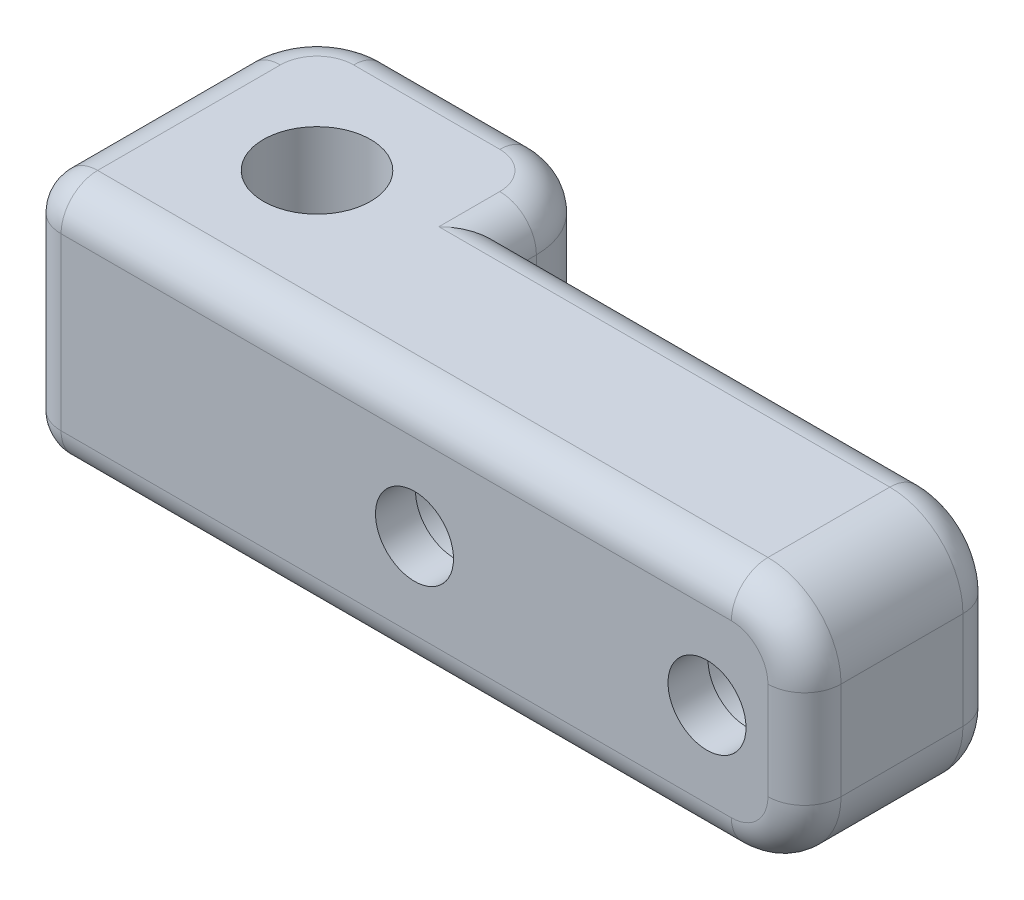
ISO-10303-21;
HEADER;
FILE_DESCRIPTION(('STEP AP214'),'2;1');
FILE_NAME('part.step','',(''),(''),'','','');
FILE_SCHEMA(('AUTOMOTIVE_DESIGN { 1 0 10303 214 1 1 1 1 }'));
ENDSEC;
DATA;
#1=APPLICATION_CONTEXT('core data for automotive mechanical design processes');
#2=APPLICATION_PROTOCOL_DEFINITION('international standard','automotive_design',2000,#1);
#3=PRODUCT_CONTEXT('',#1,'mechanical');
#4=PRODUCT('Part','Part','',(#3));
#5=PRODUCT_RELATED_PRODUCT_CATEGORY('part','',(#4));
#6=PRODUCT_DEFINITION_FORMATION('','',#4);
#7=PRODUCT_DEFINITION_CONTEXT('part definition',#1,'design');
#8=PRODUCT_DEFINITION('design','',#6,#7);
#9=PRODUCT_DEFINITION_SHAPE('','',#8);
#10=(LENGTH_UNIT() NAMED_UNIT(*) SI_UNIT(.MILLI.,.METRE.));
#11=(NAMED_UNIT(*) PLANE_ANGLE_UNIT() SI_UNIT($,.RADIAN.));
#12=(NAMED_UNIT(*) SI_UNIT($,.STERADIAN.) SOLID_ANGLE_UNIT());
#13=UNCERTAINTY_MEASURE_WITH_UNIT(LENGTH_MEASURE(1.E-05),#10,'distance_accuracy_value','');
#14=(GEOMETRIC_REPRESENTATION_CONTEXT(3) GLOBAL_UNCERTAINTY_ASSIGNED_CONTEXT((#13)) GLOBAL_UNIT_ASSIGNED_CONTEXT((#10,
#11,#12)) REPRESENTATION_CONTEXT('',''));
#15=CARTESIAN_POINT('',(0.,0.,0.));
#16=DIRECTION('',(0.,0.,1.));
#17=DIRECTION('',(1.,0.,0.));
#18=AXIS2_PLACEMENT_3D('',#15,#16,#17);
#19=CARTESIAN_POINT('',(12.,10.,0.));
#20=DIRECTION('',(-1.,0.,0.));
#21=DIRECTION('',(0.,0.,1.));
#22=AXIS2_PLACEMENT_3D('',#19,#20,#21);
#23=PLANE('',#22);
#24=DIRECTION('',(0.,1.,0.));
#25=VECTOR('',#24,1.);
#26=CARTESIAN_POINT('',(12.,10.,-8.));
#27=LINE('',#26,#25);
#28=CARTESIAN_POINT('',(12.,1.5,-8.));
#29=VERTEX_POINT('',#28);
#30=CARTESIAN_POINT('',(12.,8.5,-8.));
#31=VERTEX_POINT('',#30);
#32=EDGE_CURVE('E213',#29,#31,#27,.T.);
#33=ORIENTED_EDGE('',*,*,#32,.F.);
#34=DIRECTION('',(0.,0.,-1.));
#35=VECTOR('',#34,1.);
#36=CARTESIAN_POINT('',(12.,1.5,-9.));
#37=LINE('',#36,#35);
#38=CARTESIAN_POINT('',(12.,1.5,-9.));
#39=VERTEX_POINT('',#38);
#40=EDGE_CURVE('E188',#29,#39,#37,.T.);
#41=ORIENTED_EDGE('',*,*,#40,.T.);
#42=DIRECTION('',(0.,-1.,0.));
#43=VECTOR('',#42,1.);
#44=CARTESIAN_POINT('',(12.,10.,-9.));
#45=LINE('',#44,#43);
#46=CARTESIAN_POINT('',(12.,8.5,-9.));
#47=VERTEX_POINT('',#46);
#48=EDGE_CURVE('E210',#39,#47,#45,.F.);
#49=ORIENTED_EDGE('',*,*,#48,.T.);
#50=DIRECTION('',(0.,0.,-1.));
#51=VECTOR('',#50,1.);
#52=CARTESIAN_POINT('',(12.,8.5,0.));
#53=LINE('',#52,#51);
#54=EDGE_CURVE('E216',#47,#31,#53,.F.);
#55=ORIENTED_EDGE('',*,*,#54,.T.);
#56=EDGE_LOOP('',(#33,#41,#49,#55));
#57=FACE_BOUND('',#56,.T.);
#58=ADVANCED_FACE('F41',(#57),#23,.F.);
#59=CARTESIAN_POINT('',(0.,10.,0.));
#60=DIRECTION('',(1.,0.,0.));
#61=DIRECTION('',(0.,0.,-1.));
#62=AXIS2_PLACEMENT_3D('',#59,#60,#61);
#63=PLANE('',#62);
#64=DIRECTION('',(0.,-1.,0.));
#65=VECTOR('',#64,1.);
#66=CARTESIAN_POINT('',(0.,10.,-9.));
#67=LINE('',#66,#65);
#68=CARTESIAN_POINT('',(0.,8.5,-9.));
#69=VERTEX_POINT('',#68);
#70=CARTESIAN_POINT('',(0.,1.5,-9.));
#71=VERTEX_POINT('',#70);
#72=EDGE_CURVE('E402',#69,#71,#67,.T.);
#73=ORIENTED_EDGE('',*,*,#72,.T.);
#74=DIRECTION('',(0.,0.,1.));
#75=VECTOR('',#74,1.);
#76=CARTESIAN_POINT('',(0.,1.5,0.));
#77=LINE('',#76,#75);
#78=CARTESIAN_POINT('',(0.,1.5,-1.5));
#79=VERTEX_POINT('',#78);
#80=EDGE_CURVE('E11',#71,#79,#77,.T.);
#81=ORIENTED_EDGE('',*,*,#80,.T.);
#82=DIRECTION('',(0.,-1.,0.));
#83=VECTOR('',#82,1.);
#84=CARTESIAN_POINT('',(0.,10.,-1.5));
#85=LINE('',#84,#83);
#86=CARTESIAN_POINT('',(0.,8.5,-1.5));
#87=VERTEX_POINT('',#86);
#88=EDGE_CURVE('E57',#79,#87,#85,.F.);
#89=ORIENTED_EDGE('',*,*,#88,.T.);
#90=DIRECTION('',(0.,0.,1.));
#91=VECTOR('',#90,1.);
#92=CARTESIAN_POINT('',(0.,8.5,0.));
#93=LINE('',#92,#91);
#94=EDGE_CURVE('E50',#87,#69,#93,.F.);
#95=ORIENTED_EDGE('',*,*,#94,.T.);
#96=EDGE_LOOP('',(#73,#81,#89,#95));
#97=FACE_BOUND('',#96,.T.);
#98=ADVANCED_FACE('F452',(#97),#63,.F.);
#99=CARTESIAN_POINT('',(0.,10.,0.));
#100=DIRECTION('',(0.,0.,-1.));
#101=DIRECTION('',(-1.,0.,0.));
#102=AXIS2_PLACEMENT_3D('',#99,#100,#101);
#103=PLANE('',#102);
#104=DIRECTION('',(0.,-1.,0.));
#105=VECTOR('',#104,1.);
#106=CARTESIAN_POINT('',(1.5,10.,0.));
#107=LINE('',#106,#105);
#108=CARTESIAN_POINT('',(1.5,8.5,0.));
#109=VERTEX_POINT('',#108);
#110=CARTESIAN_POINT('',(1.5,1.5,0.));
#111=VERTEX_POINT('',#110);
#112=EDGE_CURVE('E300',#109,#111,#107,.T.);
#113=ORIENTED_EDGE('',*,*,#112,.T.);
#114=DIRECTION('',(1.,0.,0.));
#115=VECTOR('',#114,1.);
#116=CARTESIAN_POINT('',(29.,1.5,0.));
#117=LINE('',#116,#115);
#118=CARTESIAN_POINT('',(29.,1.5,0.));
#119=VERTEX_POINT('',#118);
#120=EDGE_CURVE('E310',#111,#119,#117,.T.);
#121=ORIENTED_EDGE('',*,*,#120,.T.);
#122=CARTESIAN_POINT('',(29.,3.,0.));
#123=DIRECTION('',(0.,0.,-1.));
#124=DIRECTION('',(-1.,0.,0.));
#125=AXIS2_PLACEMENT_3D('',#122,#123,#124);
#126=CIRCLE('',#125,1.5);
#127=CARTESIAN_POINT('',(30.5,3.,0.));
#128=VERTEX_POINT('',#127);
#129=EDGE_CURVE('E308',#119,#128,#126,.F.);
#130=ORIENTED_EDGE('',*,*,#129,.T.);
#131=DIRECTION('',(0.,-1.,0.));
#132=VECTOR('',#131,1.);
#133=CARTESIAN_POINT('',(30.5,7.,0.));
#134=LINE('',#133,#132);
#135=CARTESIAN_POINT('',(30.5,7.,0.));
#136=VERTEX_POINT('',#135);
#137=EDGE_CURVE('E306',#128,#136,#134,.F.);
#138=ORIENTED_EDGE('',*,*,#137,.T.);
#139=CARTESIAN_POINT('',(29.,7.,0.));
#140=DIRECTION('',(0.,0.,-1.));
#141=DIRECTION('',(-1.,0.,0.));
#142=AXIS2_PLACEMENT_3D('',#139,#140,#141);
#143=CIRCLE('',#142,1.5);
#144=CARTESIAN_POINT('',(29.,8.5,0.));
#145=VERTEX_POINT('',#144);
#146=EDGE_CURVE('E304',#136,#145,#143,.F.);
#147=ORIENTED_EDGE('',*,*,#146,.T.);
#148=DIRECTION('',(1.,0.,0.));
#149=VECTOR('',#148,1.);
#150=CARTESIAN_POINT('',(0.,8.5,0.));
#151=LINE('',#150,#149);
#152=EDGE_CURVE('E302',#145,#109,#151,.F.);
#153=ORIENTED_EDGE('',*,*,#152,.T.);
#154=EDGE_LOOP('',(#113,#121,#130,#138,#147,#153));
#155=FACE_BOUND('',#154,.T.);
#156=CARTESIAN_POINT('',(28.,5.,0.));
#157=DIRECTION('',(0.,0.,1.));
#158=DIRECTION('',(1.,0.,0.));
#159=AXIS2_PLACEMENT_3D('',#156,#157,#158);
#160=CIRCLE('',#159,1.59999999999999);
#161=CARTESIAN_POINT('',(29.6,5.,0.));
#162=VERTEX_POINT('',#161);
#163=EDGE_CURVE('E236',#162,#162,#160,.T.);
#164=ORIENTED_EDGE('',*,*,#163,.F.);
#165=EDGE_LOOP('',(#164));
#166=FACE_BOUND('',#165,.T.);
#167=CARTESIAN_POINT('',(16.,5.,0.));
#168=DIRECTION('',(0.,0.,1.));
#169=DIRECTION('',(1.,0.,0.));
#170=AXIS2_PLACEMENT_3D('',#167,#168,#169);
#171=CIRCLE('',#170,1.59999999999999);
#172=CARTESIAN_POINT('',(17.6,5.,0.));
#173=VERTEX_POINT('',#172);
#174=EDGE_CURVE('E398',#173,#173,#171,.T.);
#175=ORIENTED_EDGE('',*,*,#174,.F.);
#176=EDGE_LOOP('',(#175));
#177=FACE_BOUND('',#176,.T.);
#178=ADVANCED_FACE('F515',(#155,#166,#177),#103,.F.);
#179=CARTESIAN_POINT('',(0.,10.,-12.));
#180=DIRECTION('',(0.,0.,1.));
#181=DIRECTION('',(1.,0.,0.));
#182=AXIS2_PLACEMENT_3D('',#179,#180,#181);
#183=PLANE('',#182);
#184=DIRECTION('',(0.,-1.,0.));
#185=VECTOR('',#184,1.);
#186=CARTESIAN_POINT('',(9.,10.,-12.));
#187=LINE('',#186,#185);
#188=CARTESIAN_POINT('',(9.,8.5,-12.));
#189=VERTEX_POINT('',#188);
#190=CARTESIAN_POINT('',(9.,1.5,-12.));
#191=VERTEX_POINT('',#190);
#192=EDGE_CURVE('E407',#189,#191,#187,.T.);
#193=ORIENTED_EDGE('',*,*,#192,.T.);
#194=DIRECTION('',(-1.,0.,0.));
#195=VECTOR('',#194,1.);
#196=CARTESIAN_POINT('',(3.,1.5,-12.));
#197=LINE('',#196,#195);
#198=CARTESIAN_POINT('',(3.,1.5,-12.));
#199=VERTEX_POINT('',#198);
#200=EDGE_CURVE('E258',#191,#199,#197,.T.);
#201=ORIENTED_EDGE('',*,*,#200,.T.);
#202=DIRECTION('',(0.,-1.,0.));
#203=VECTOR('',#202,1.);
#204=CARTESIAN_POINT('',(3.,10.,-12.));
#205=LINE('',#204,#203);
#206=CARTESIAN_POINT('',(3.,8.5,-12.));
#207=VERTEX_POINT('',#206);
#208=EDGE_CURVE('E227',#199,#207,#205,.F.);
#209=ORIENTED_EDGE('',*,*,#208,.T.);
#210=DIRECTION('',(-1.,0.,0.));
#211=VECTOR('',#210,1.);
#212=CARTESIAN_POINT('',(0.,8.5,-12.));
#213=LINE('',#212,#211);
#214=EDGE_CURVE('E204',#207,#189,#213,.F.);
#215=ORIENTED_EDGE('',*,*,#214,.T.);
#216=EDGE_LOOP('',(#193,#201,#209,#215));
#217=FACE_BOUND('',#216,.T.);
#218=ADVANCED_FACE('F411',(#217),#183,.F.);
#219=CARTESIAN_POINT('',(0.,10.,0.));
#220=DIRECTION('',(0.,-1.,0.));
#221=DIRECTION('',(0.,0.,-1.));
#222=AXIS2_PLACEMENT_3D('',#219,#220,#221);
#223=PLANE('',#222);
#224=CARTESIAN_POINT('',(6.,10.,-6.));
#225=DIRECTION('',(0.,1.,0.));
#226=DIRECTION('',(0.,0.,1.));
#227=AXIS2_PLACEMENT_3D('',#224,#225,#226);
#228=CIRCLE('',#227,2.20000000000001);
#229=CARTESIAN_POINT('',(6.,10.,-3.79999999999999));
#230=VERTEX_POINT('',#229);
#231=EDGE_CURVE('E940',#230,#230,#228,.T.);
#232=ORIENTED_EDGE('',*,*,#231,.F.);
#233=EDGE_LOOP('',(#232));
#234=FACE_BOUND('',#233,.T.);
#235=DIRECTION('',(0.,0.,1.));
#236=VECTOR('',#235,1.);
#237=CARTESIAN_POINT('',(29.,10.,-8.));
#238=LINE('',#237,#236);
#239=CARTESIAN_POINT('',(29.,10.,-1.5));
#240=VERTEX_POINT('',#239);
#241=CARTESIAN_POINT('',(29.,10.,-6.5));
#242=VERTEX_POINT('',#241);
#243=EDGE_CURVE('E221',#240,#242,#238,.F.);
#244=ORIENTED_EDGE('',*,*,#243,.T.);
#245=DIRECTION('',(-1.,0.,0.));
#246=VECTOR('',#245,1.);
#247=CARTESIAN_POINT('',(0.,10.,-6.5));
#248=LINE('',#247,#246);
#249=CARTESIAN_POINT('',(10.5,10.,-6.5));
#250=VERTEX_POINT('',#249);
#251=EDGE_CURVE('E298',#242,#250,#248,.T.);
#252=ORIENTED_EDGE('',*,*,#251,.T.);
#253=DIRECTION('',(0.,0.,-1.));
#254=VECTOR('',#253,1.);
#255=CARTESIAN_POINT('',(10.5,10.,0.));
#256=LINE('',#255,#254);
#257=CARTESIAN_POINT('',(10.5,10.,-9.));
#258=VERTEX_POINT('',#257);
#259=EDGE_CURVE('E296',#250,#258,#256,.T.);
#260=ORIENTED_EDGE('',*,*,#259,.T.);
#261=CARTESIAN_POINT('',(9.,10.,-9.));
#262=DIRECTION('',(0.,-1.,0.));
#263=DIRECTION('',(0.,0.,-1.));
#264=AXIS2_PLACEMENT_3D('',#261,#262,#263);
#265=CIRCLE('',#264,1.5);
#266=CARTESIAN_POINT('',(9.,10.,-10.5));
#267=VERTEX_POINT('',#266);
#268=EDGE_CURVE('E294',#258,#267,#265,.F.);
#269=ORIENTED_EDGE('',*,*,#268,.T.);
#270=DIRECTION('',(-1.,0.,0.));
#271=VECTOR('',#270,1.);
#272=CARTESIAN_POINT('',(0.,10.,-10.5));
#273=LINE('',#272,#271);
#274=CARTESIAN_POINT('',(3.,10.,-10.5));
#275=VERTEX_POINT('',#274);
#276=EDGE_CURVE('E292',#267,#275,#273,.T.);
#277=ORIENTED_EDGE('',*,*,#276,.T.);
#278=CARTESIAN_POINT('',(3.,10.,-9.));
#279=DIRECTION('',(0.,-1.,0.));
#280=DIRECTION('',(0.,0.,-1.));
#281=AXIS2_PLACEMENT_3D('',#278,#279,#280);
#282=CIRCLE('',#281,1.5);
#283=CARTESIAN_POINT('',(1.5,10.,-9.));
#284=VERTEX_POINT('',#283);
#285=EDGE_CURVE('E290',#275,#284,#282,.F.);
#286=ORIENTED_EDGE('',*,*,#285,.T.);
#287=DIRECTION('',(0.,0.,1.));
#288=VECTOR('',#287,1.);
#289=CARTESIAN_POINT('',(1.5,10.,0.));
#290=LINE('',#289,#288);
#291=CARTESIAN_POINT('',(1.5,10.,-1.5));
#292=VERTEX_POINT('',#291);
#293=EDGE_CURVE('E288',#284,#292,#290,.T.);
#294=ORIENTED_EDGE('',*,*,#293,.T.);
#295=DIRECTION('',(1.,0.,0.));
#296=VECTOR('',#295,1.);
#297=CARTESIAN_POINT('',(0.,10.,-1.5));
#298=LINE('',#297,#296);
#299=EDGE_CURVE('E286',#292,#240,#298,.T.);
#300=ORIENTED_EDGE('',*,*,#299,.T.);
#301=EDGE_LOOP('',(#244,#252,#260,#269,#277,#286,#294,#300));
#302=FACE_BOUND('',#301,.T.);
#303=ADVANCED_FACE('F474',(#234,#302),#223,.F.);
#304=CARTESIAN_POINT('',(0.,0.,0.));
#305=DIRECTION('',(0.,-1.,0.));
#306=DIRECTION('',(0.,0.,-1.));
#307=AXIS2_PLACEMENT_3D('',#304,#305,#306);
#308=PLANE('',#307);
#309=CARTESIAN_POINT('',(6.,0.,-6.));
#310=DIRECTION('',(0.,-1.,0.));
#311=DIRECTION('',(0.,0.,-1.));
#312=AXIS2_PLACEMENT_3D('',#309,#310,#311);
#313=CIRCLE('',#312,1.60000000000001);
#314=CARTESIAN_POINT('',(6.,0.,-7.60000000000001));
#315=VERTEX_POINT('',#314);
#316=EDGE_CURVE('E45',#315,#315,#313,.T.);
#317=ORIENTED_EDGE('',*,*,#316,.F.);
#318=EDGE_LOOP('',(#317));
#319=FACE_BOUND('',#318,.T.);
#320=DIRECTION('',(0.,0.,-1.));
#321=VECTOR('',#320,1.);
#322=CARTESIAN_POINT('',(10.5,0.,-8.));
#323=LINE('',#322,#321);
#324=CARTESIAN_POINT('',(10.5,0.,-9.));
#325=VERTEX_POINT('',#324);
#326=CARTESIAN_POINT('',(10.5,0.,-6.5));
#327=VERTEX_POINT('',#326);
#328=EDGE_CURVE('E190',#325,#327,#323,.F.);
#329=ORIENTED_EDGE('',*,*,#328,.T.);
#330=DIRECTION('',(-1.,0.,0.));
#331=VECTOR('',#330,1.);
#332=CARTESIAN_POINT('',(29.,0.,-6.5));
#333=LINE('',#332,#331);
#334=CARTESIAN_POINT('',(29.,0.,-6.5));
#335=VERTEX_POINT('',#334);
#336=EDGE_CURVE('E254',#327,#335,#333,.F.);
#337=ORIENTED_EDGE('',*,*,#336,.T.);
#338=DIRECTION('',(0.,0.,-1.));
#339=VECTOR('',#338,1.);
#340=CARTESIAN_POINT('',(29.,0.,0.));
#341=LINE('',#340,#339);
#342=CARTESIAN_POINT('',(29.,0.,-1.5));
#343=VERTEX_POINT('',#342);
#344=EDGE_CURVE('E404',#335,#343,#341,.F.);
#345=ORIENTED_EDGE('',*,*,#344,.T.);
#346=DIRECTION('',(1.,0.,0.));
#347=VECTOR('',#346,1.);
#348=CARTESIAN_POINT('',(0.,0.,-1.5));
#349=LINE('',#348,#347);
#350=CARTESIAN_POINT('',(1.5,0.,-1.5));
#351=VERTEX_POINT('',#350);
#352=EDGE_CURVE('E245',#343,#351,#349,.F.);
#353=ORIENTED_EDGE('',*,*,#352,.T.);
#354=DIRECTION('',(0.,0.,1.));
#355=VECTOR('',#354,1.);
#356=CARTESIAN_POINT('',(1.5,0.,-9.));
#357=LINE('',#356,#355);
#358=CARTESIAN_POINT('',(1.5,0.,-9.));
#359=VERTEX_POINT('',#358);
#360=EDGE_CURVE('E215',#351,#359,#357,.F.);
#361=ORIENTED_EDGE('',*,*,#360,.T.);
#362=CARTESIAN_POINT('',(3.,0.,-9.));
#363=DIRECTION('',(0.,-1.,0.));
#364=DIRECTION('',(0.,0.,-1.));
#365=AXIS2_PLACEMENT_3D('',#362,#363,#364);
#366=CIRCLE('',#365,1.5);
#367=CARTESIAN_POINT('',(3.,0.,-10.5));
#368=VERTEX_POINT('',#367);
#369=EDGE_CURVE('E247',#359,#368,#366,.T.);
#370=ORIENTED_EDGE('',*,*,#369,.T.);
#371=DIRECTION('',(-1.,0.,0.));
#372=VECTOR('',#371,1.);
#373=CARTESIAN_POINT('',(9.,0.,-10.5));
#374=LINE('',#373,#372);
#375=CARTESIAN_POINT('',(9.,0.,-10.5));
#376=VERTEX_POINT('',#375);
#377=EDGE_CURVE('E249',#368,#376,#374,.F.);
#378=ORIENTED_EDGE('',*,*,#377,.T.);
#379=CARTESIAN_POINT('',(9.,0.,-9.));
#380=DIRECTION('',(0.,-1.,0.));
#381=DIRECTION('',(0.,0.,-1.));
#382=AXIS2_PLACEMENT_3D('',#379,#380,#381);
#383=CIRCLE('',#382,1.5);
#384=EDGE_CURVE('E251',#376,#325,#383,.T.);
#385=ORIENTED_EDGE('',*,*,#384,.T.);
#386=EDGE_LOOP('',(#329,#337,#345,#353,#361,#370,#378,#385));
#387=FACE_BOUND('',#386,.T.);
#388=ADVANCED_FACE('F441',(#319,#387),#308,.T.);
#389=CARTESIAN_POINT('',(32.,10.,-8.));
#390=DIRECTION('',(0.,0.,1.));
#391=DIRECTION('',(0.,-1.,0.));
#392=AXIS2_PLACEMENT_3D('',#389,#390,#391);
#393=PLANE('',#392);
#394=CARTESIAN_POINT('',(28.,5.,-8.));
#395=DIRECTION('',(0.,0.,-1.));
#396=DIRECTION('',(0.,1.,0.));
#397=AXIS2_PLACEMENT_3D('',#394,#395,#396);
#398=CIRCLE('',#397,2.19999999999999);
#399=CARTESIAN_POINT('',(28.,7.19999999999999,-8.));
#400=VERTEX_POINT('',#399);
#401=EDGE_CURVE('E377',#400,#400,#398,.T.);
#402=ORIENTED_EDGE('',*,*,#401,.F.);
#403=EDGE_LOOP('',(#402));
#404=FACE_BOUND('',#403,.T.);
#405=CARTESIAN_POINT('',(16.,5.,-8.));
#406=DIRECTION('',(0.,0.,-1.));
#407=DIRECTION('',(0.,1.,0.));
#408=AXIS2_PLACEMENT_3D('',#405,#406,#407);
#409=CIRCLE('',#408,2.19999999999999);
#410=CARTESIAN_POINT('',(16.,7.19999999999999,-8.));
#411=VERTEX_POINT('',#410);
#412=EDGE_CURVE('E241',#411,#411,#409,.T.);
#413=ORIENTED_EDGE('',*,*,#412,.F.);
#414=EDGE_LOOP('',(#413));
#415=FACE_BOUND('',#414,.T.);
#416=CARTESIAN_POINT('',(29.,3.,-8.));
#417=DIRECTION('',(0.,0.,1.));
#418=DIRECTION('',(0.,-1.,0.));
#419=AXIS2_PLACEMENT_3D('',#416,#417,#418);
#420=CIRCLE('',#419,1.5);
#421=CARTESIAN_POINT('',(30.5,3.,-8.));
#422=VERTEX_POINT('',#421);
#423=CARTESIAN_POINT('',(29.,1.5,-8.));
#424=VERTEX_POINT('',#423);
#425=EDGE_CURVE('E270',#422,#424,#420,.F.);
#426=ORIENTED_EDGE('',*,*,#425,.T.);
#427=DIRECTION('',(-1.,0.,0.));
#428=VECTOR('',#427,1.);
#429=CARTESIAN_POINT('',(12.,1.5,-8.));
#430=LINE('',#429,#428);
#431=EDGE_CURVE('E272',#424,#29,#430,.T.);
#432=ORIENTED_EDGE('',*,*,#431,.T.);
#433=ORIENTED_EDGE('',*,*,#32,.T.);
#434=DIRECTION('',(-1.,0.,0.));
#435=VECTOR('',#434,1.);
#436=CARTESIAN_POINT('',(32.,8.5,-8.));
#437=LINE('',#436,#435);
#438=CARTESIAN_POINT('',(29.,8.5,-8.));
#439=VERTEX_POINT('',#438);
#440=EDGE_CURVE('E264',#31,#439,#437,.F.);
#441=ORIENTED_EDGE('',*,*,#440,.T.);
#442=CARTESIAN_POINT('',(29.,7.,-8.));
#443=DIRECTION('',(0.,0.,1.));
#444=DIRECTION('',(0.,-1.,0.));
#445=AXIS2_PLACEMENT_3D('',#442,#443,#444);
#446=CIRCLE('',#445,1.5);
#447=CARTESIAN_POINT('',(30.5,7.,-8.));
#448=VERTEX_POINT('',#447);
#449=EDGE_CURVE('E266',#439,#448,#446,.F.);
#450=ORIENTED_EDGE('',*,*,#449,.T.);
#451=DIRECTION('',(0.,1.,0.));
#452=VECTOR('',#451,1.);
#453=CARTESIAN_POINT('',(30.5,3.,-8.));
#454=LINE('',#453,#452);
#455=EDGE_CURVE('E268',#448,#422,#454,.F.);
#456=ORIENTED_EDGE('',*,*,#455,.T.);
#457=EDGE_LOOP('',(#426,#432,#433,#441,#450,#456));
#458=FACE_BOUND('',#457,.T.);
#459=ADVANCED_FACE('F431',(#404,#415,#458),#393,.F.);
#460=CARTESIAN_POINT('',(32.,0.,0.));
#461=DIRECTION('',(1.,0.,0.));
#462=DIRECTION('',(0.,0.,-1.));
#463=AXIS2_PLACEMENT_3D('',#460,#461,#462);
#464=PLANE('',#463);
#465=DIRECTION('',(0.,0.,-1.));
#466=VECTOR('',#465,1.);
#467=CARTESIAN_POINT('',(32.,3.,0.));
#468=LINE('',#467,#466);
#469=CARTESIAN_POINT('',(32.,3.,-1.5));
#470=VERTEX_POINT('',#469);
#471=CARTESIAN_POINT('',(32.,3.,-6.5));
#472=VERTEX_POINT('',#471);
#473=EDGE_CURVE('E224',#470,#472,#468,.T.);
#474=ORIENTED_EDGE('',*,*,#473,.T.);
#475=DIRECTION('',(0.,1.,0.));
#476=VECTOR('',#475,1.);
#477=CARTESIAN_POINT('',(32.,7.,-6.5));
#478=LINE('',#477,#476);
#479=CARTESIAN_POINT('',(32.,7.,-6.5));
#480=VERTEX_POINT('',#479);
#481=EDGE_CURVE('E280',#472,#480,#478,.T.);
#482=ORIENTED_EDGE('',*,*,#481,.T.);
#483=DIRECTION('',(0.,0.,1.));
#484=VECTOR('',#483,1.);
#485=CARTESIAN_POINT('',(32.,7.,0.));
#486=LINE('',#485,#484);
#487=CARTESIAN_POINT('',(32.,7.,-1.5));
#488=VERTEX_POINT('',#487);
#489=EDGE_CURVE('E220',#480,#488,#486,.T.);
#490=ORIENTED_EDGE('',*,*,#489,.T.);
#491=DIRECTION('',(0.,-1.,0.));
#492=VECTOR('',#491,1.);
#493=CARTESIAN_POINT('',(32.,3.,-1.5));
#494=LINE('',#493,#492);
#495=EDGE_CURVE('E278',#488,#470,#494,.T.);
#496=ORIENTED_EDGE('',*,*,#495,.T.);
#497=EDGE_LOOP('',(#474,#482,#490,#496));
#498=FACE_BOUND('',#497,.T.);
#499=ADVANCED_FACE('F491',(#498),#464,.T.);
#500=CARTESIAN_POINT('',(16.,5.,0.));
#501=DIRECTION('',(0.,0.,1.));
#502=DIRECTION('',(1.,0.,0.));
#503=AXIS2_PLACEMENT_3D('',#500,#501,#502);
#504=CYLINDRICAL_SURFACE('',#503,1.59999999999999);
#505=CARTESIAN_POINT('',(16.,5.,-1.63948362858346));
#506=DIRECTION('',(0.,0.,-1.));
#507=DIRECTION('',(0.,1.,0.));
#508=AXIS2_PLACEMENT_3D('',#505,#506,#507);
#509=CIRCLE('',#508,1.59999999999999);
#510=CARTESIAN_POINT('',(16.,6.59999999999999,-1.63948362858346));
#511=VERTEX_POINT('',#510);
#512=EDGE_CURVE('E233',#511,#511,#509,.T.);
#513=ORIENTED_EDGE('',*,*,#512,.T.);
#514=EDGE_LOOP('',(#513));
#515=FACE_BOUND('',#514,.T.);
#516=ORIENTED_EDGE('',*,*,#174,.T.);
#517=EDGE_LOOP('',(#516));
#518=FACE_BOUND('',#517,.T.);
#519=ADVANCED_FACE('F844',(#515,#518),#504,.F.);
#520=CARTESIAN_POINT('',(28.,5.,0.));
#521=DIRECTION('',(0.,0.,1.));
#522=DIRECTION('',(1.,0.,0.));
#523=AXIS2_PLACEMENT_3D('',#520,#521,#522);
#524=CYLINDRICAL_SURFACE('',#523,1.59999999999999);
#525=CARTESIAN_POINT('',(28.,5.,-1.63948362858346));
#526=DIRECTION('',(0.,0.,-1.));
#527=DIRECTION('',(0.,1.,0.));
#528=AXIS2_PLACEMENT_3D('',#525,#526,#527);
#529=CIRCLE('',#528,1.59999999999999);
#530=CARTESIAN_POINT('',(28.,6.59999999999999,-1.63948362858346));
#531=VERTEX_POINT('',#530);
#532=EDGE_CURVE('E238',#531,#531,#529,.T.);
#533=ORIENTED_EDGE('',*,*,#532,.T.);
#534=EDGE_LOOP('',(#533));
#535=FACE_BOUND('',#534,.T.);
#536=ORIENTED_EDGE('',*,*,#163,.T.);
#537=EDGE_LOOP('',(#536));
#538=FACE_BOUND('',#537,.T.);
#539=ADVANCED_FACE('F542',(#535,#538),#524,.F.);
#540=CARTESIAN_POINT('',(3.,10.,-9.));
#541=DIRECTION('',(0.,-1.,0.));
#542=DIRECTION('',(0.,0.,-1.));
#543=AXIS2_PLACEMENT_3D('',#540,#541,#542);
#544=CYLINDRICAL_SURFACE('',#543,3.);
#545=ORIENTED_EDGE('',*,*,#208,.F.);
#546=CARTESIAN_POINT('',(3.,1.5,-9.));
#547=DIRECTION('',(0.,-1.,0.));
#548=DIRECTION('',(0.,0.,-1.));
#549=AXIS2_PLACEMENT_3D('',#546,#547,#548);
#550=CIRCLE('',#549,3.);
#551=EDGE_CURVE('E262',#199,#71,#550,.F.);
#552=ORIENTED_EDGE('',*,*,#551,.T.);
#553=ORIENTED_EDGE('',*,*,#72,.F.);
#554=CARTESIAN_POINT('',(3.,8.5,-9.));
#555=DIRECTION('',(0.,-1.,0.));
#556=DIRECTION('',(0.,0.,-1.));
#557=AXIS2_PLACEMENT_3D('',#554,#555,#556);
#558=CIRCLE('',#557,3.);
#559=EDGE_CURVE('E260',#69,#207,#558,.T.);
#560=ORIENTED_EDGE('',*,*,#559,.T.);
#561=EDGE_LOOP('',(#545,#552,#553,#560));
#562=FACE_BOUND('',#561,.T.);
#563=ADVANCED_FACE('F451',(#562),#544,.T.);
#564=CARTESIAN_POINT('',(9.,10.,-9.));
#565=DIRECTION('',(0.,-1.,0.));
#566=DIRECTION('',(0.,0.,-1.));
#567=AXIS2_PLACEMENT_3D('',#564,#565,#566);
#568=CYLINDRICAL_SURFACE('',#567,3.);
#569=ORIENTED_EDGE('',*,*,#48,.F.);
#570=CARTESIAN_POINT('',(9.,1.5,-9.));
#571=DIRECTION('',(0.,-1.,0.));
#572=DIRECTION('',(0.,0.,-1.));
#573=AXIS2_PLACEMENT_3D('',#570,#571,#572);
#574=CIRCLE('',#573,3.);
#575=EDGE_CURVE('E196',#39,#191,#574,.F.);
#576=ORIENTED_EDGE('',*,*,#575,.T.);
#577=ORIENTED_EDGE('',*,*,#192,.F.);
#578=CARTESIAN_POINT('',(9.,8.5,-9.));
#579=DIRECTION('',(0.,-1.,0.));
#580=DIRECTION('',(0.,0.,-1.));
#581=AXIS2_PLACEMENT_3D('',#578,#579,#580);
#582=CIRCLE('',#581,3.);
#583=EDGE_CURVE('E205',#189,#47,#582,.T.);
#584=ORIENTED_EDGE('',*,*,#583,.T.);
#585=EDGE_LOOP('',(#569,#576,#577,#584));
#586=FACE_BOUND('',#585,.T.);
#587=ADVANCED_FACE('F218',(#586),#568,.T.);
#588=CARTESIAN_POINT('',(29.,3.,0.));
#589=DIRECTION('',(0.,0.,-1.));
#590=DIRECTION('',(-1.,0.,0.));
#591=AXIS2_PLACEMENT_3D('',#588,#589,#590);
#592=CYLINDRICAL_SURFACE('',#591,3.);
#593=ORIENTED_EDGE('',*,*,#344,.F.);
#594=CARTESIAN_POINT('',(29.,3.,-6.5));
#595=DIRECTION('',(0.,0.,1.));
#596=DIRECTION('',(0.,-1.,0.));
#597=AXIS2_PLACEMENT_3D('',#594,#595,#596);
#598=CIRCLE('',#597,3.);
#599=EDGE_CURVE('E276',#335,#472,#598,.T.);
#600=ORIENTED_EDGE('',*,*,#599,.T.);
#601=ORIENTED_EDGE('',*,*,#473,.F.);
#602=CARTESIAN_POINT('',(29.,3.,-1.5));
#603=DIRECTION('',(0.,0.,-1.));
#604=DIRECTION('',(-1.,0.,0.));
#605=AXIS2_PLACEMENT_3D('',#602,#603,#604);
#606=CIRCLE('',#605,3.);
#607=EDGE_CURVE('E274',#470,#343,#606,.T.);
#608=ORIENTED_EDGE('',*,*,#607,.T.);
#609=EDGE_LOOP('',(#593,#600,#601,#608));
#610=FACE_BOUND('',#609,.T.);
#611=ADVANCED_FACE('F503',(#610),#592,.T.);
#612=CARTESIAN_POINT('',(29.,7.,0.));
#613=DIRECTION('',(0.,0.,-1.));
#614=DIRECTION('',(-1.,0.,0.));
#615=AXIS2_PLACEMENT_3D('',#612,#613,#614);
#616=CYLINDRICAL_SURFACE('',#615,3.);
#617=ORIENTED_EDGE('',*,*,#489,.F.);
#618=CARTESIAN_POINT('',(29.,7.,-6.5));
#619=DIRECTION('',(0.,0.,1.));
#620=DIRECTION('',(0.,-1.,0.));
#621=AXIS2_PLACEMENT_3D('',#618,#619,#620);
#622=CIRCLE('',#621,3.);
#623=EDGE_CURVE('E284',#480,#242,#622,.T.);
#624=ORIENTED_EDGE('',*,*,#623,.T.);
#625=ORIENTED_EDGE('',*,*,#243,.F.);
#626=CARTESIAN_POINT('',(29.,7.,-1.5));
#627=DIRECTION('',(0.,0.,-1.));
#628=DIRECTION('',(-1.,0.,0.));
#629=AXIS2_PLACEMENT_3D('',#626,#627,#628);
#630=CIRCLE('',#629,3.);
#631=EDGE_CURVE('E282',#240,#488,#630,.T.);
#632=ORIENTED_EDGE('',*,*,#631,.T.);
#633=EDGE_LOOP('',(#617,#624,#625,#632));
#634=FACE_BOUND('',#633,.T.);
#635=ADVANCED_FACE('F488',(#634),#616,.T.);
#636=CARTESIAN_POINT('',(16.,5.,-2.));
#637=DIRECTION('',(0.,0.,-1.));
#638=DIRECTION('',(0.,1.,0.));
#639=AXIS2_PLACEMENT_3D('',#636,#637,#638);
#640=CONICAL_SURFACE('',#639,2.2,1.02974425867665);
#641=CARTESIAN_POINT('',(16.,5.,-2.));
#642=DIRECTION('',(0.,0.,-1.));
#643=DIRECTION('',(0.,1.,0.));
#644=AXIS2_PLACEMENT_3D('',#641,#642,#643);
#645=CIRCLE('',#644,2.2);
#646=CARTESIAN_POINT('',(16.,7.2,-2.));
#647=VERTEX_POINT('',#646);
#648=EDGE_CURVE('E237',#647,#647,#645,.T.);
#649=ORIENTED_EDGE('',*,*,#648,.T.);
#650=EDGE_LOOP('',(#649));
#651=FACE_BOUND('',#650,.T.);
#652=ORIENTED_EDGE('',*,*,#512,.F.);
#653=EDGE_LOOP('',(#652));
#654=FACE_BOUND('',#653,.T.);
#655=ADVANCED_FACE('F549',(#651,#654),#640,.F.);
#656=CARTESIAN_POINT('',(16.,5.,-8.));
#657=DIRECTION('',(0.,0.,-1.));
#658=DIRECTION('',(0.,1.,0.));
#659=AXIS2_PLACEMENT_3D('',#656,#657,#658);
#660=CYLINDRICAL_SURFACE('',#659,2.2);
#661=ORIENTED_EDGE('',*,*,#648,.F.);
#662=EDGE_LOOP('',(#661));
#663=FACE_BOUND('',#662,.T.);
#664=ORIENTED_EDGE('',*,*,#412,.T.);
#665=EDGE_LOOP('',(#664));
#666=FACE_BOUND('',#665,.T.);
#667=ADVANCED_FACE('F799',(#663,#666),#660,.F.);
#668=CARTESIAN_POINT('',(28.,5.,-2.));
#669=DIRECTION('',(0.,0.,-1.));
#670=DIRECTION('',(0.,1.,0.));
#671=AXIS2_PLACEMENT_3D('',#668,#669,#670);
#672=CONICAL_SURFACE('',#671,2.2,1.02974425867665);
#673=CARTESIAN_POINT('',(28.,5.,-2.));
#674=DIRECTION('',(0.,0.,-1.));
#675=DIRECTION('',(0.,1.,0.));
#676=AXIS2_PLACEMENT_3D('',#673,#674,#675);
#677=CIRCLE('',#676,2.2);
#678=CARTESIAN_POINT('',(28.,7.2,-2.));
#679=VERTEX_POINT('',#678);
#680=EDGE_CURVE('E242',#679,#679,#677,.T.);
#681=ORIENTED_EDGE('',*,*,#680,.T.);
#682=EDGE_LOOP('',(#681));
#683=FACE_BOUND('',#682,.T.);
#684=ORIENTED_EDGE('',*,*,#532,.F.);
#685=EDGE_LOOP('',(#684));
#686=FACE_BOUND('',#685,.T.);
#687=ADVANCED_FACE('F790',(#683,#686),#672,.F.);
#688=CARTESIAN_POINT('',(28.,5.,-8.));
#689=DIRECTION('',(0.,0.,-1.));
#690=DIRECTION('',(0.,1.,0.));
#691=AXIS2_PLACEMENT_3D('',#688,#689,#690);
#692=CYLINDRICAL_SURFACE('',#691,2.19999999999999);
#693=ORIENTED_EDGE('',*,*,#680,.F.);
#694=EDGE_LOOP('',(#693));
#695=FACE_BOUND('',#694,.T.);
#696=ORIENTED_EDGE('',*,*,#401,.T.);
#697=EDGE_LOOP('',(#696));
#698=FACE_BOUND('',#697,.T.);
#699=ADVANCED_FACE('F783',(#695,#698),#692,.F.);
#700=CARTESIAN_POINT('',(3.,8.5,-9.));
#701=DIRECTION('',(0.,-1.,0.));
#702=DIRECTION('',(0.,0.,-1.));
#703=AXIS2_PLACEMENT_3D('',#700,#701,#702);
#704=DEGENERATE_TOROIDAL_SURFACE('',#703,1.5,1.5,.T.);
#705=CARTESIAN_POINT('',(1.5,8.5,-9.));
#706=DIRECTION('',(0.,0.,1.));
#707=DIRECTION('',(1.,0.,0.));
#708=AXIS2_PLACEMENT_3D('',#705,#706,#707);
#709=CIRCLE('',#708,1.5);
#710=EDGE_CURVE('E373',#284,#69,#709,.T.);
#711=ORIENTED_EDGE('',*,*,#710,.F.);
#712=ORIENTED_EDGE('',*,*,#285,.F.);
#713=CARTESIAN_POINT('',(3.,8.5,-10.5));
#714=DIRECTION('',(1.,0.,0.));
#715=DIRECTION('',(0.,0.,-1.));
#716=AXIS2_PLACEMENT_3D('',#713,#714,#715);
#717=CIRCLE('',#716,1.5);
#718=EDGE_CURVE('E375',#207,#275,#717,.T.);
#719=ORIENTED_EDGE('',*,*,#718,.F.);
#720=ORIENTED_EDGE('',*,*,#559,.F.);
#721=EDGE_LOOP('',(#711,#712,#719,#720));
#722=FACE_BOUND('',#721,.T.);
#723=ADVANCED_FACE('F43',(#722),#704,.T.);
#724=CARTESIAN_POINT('',(29.,7.,-1.5));
#725=DIRECTION('',(0.,0.,-1.));
#726=DIRECTION('',(-1.,0.,0.));
#727=AXIS2_PLACEMENT_3D('',#724,#725,#726);
#728=DEGENERATE_TOROIDAL_SURFACE('',#727,1.5,1.5,.T.);
#729=CARTESIAN_POINT('',(30.5,7.,-1.5));
#730=DIRECTION('',(0.,-1.,0.));
#731=DIRECTION('',(0.,0.,-1.));
#732=AXIS2_PLACEMENT_3D('',#729,#730,#731);
#733=CIRCLE('',#732,1.5);
#734=EDGE_CURVE('E367',#488,#136,#733,.T.);
#735=ORIENTED_EDGE('',*,*,#734,.F.);
#736=ORIENTED_EDGE('',*,*,#631,.F.);
#737=CARTESIAN_POINT('',(29.,8.5,-1.5));
#738=DIRECTION('',(-1.,0.,0.));
#739=DIRECTION('',(0.,0.,1.));
#740=AXIS2_PLACEMENT_3D('',#737,#738,#739);
#741=CIRCLE('',#740,1.5);
#742=EDGE_CURVE('E370',#145,#240,#741,.T.);
#743=ORIENTED_EDGE('',*,*,#742,.F.);
#744=ORIENTED_EDGE('',*,*,#146,.F.);
#745=EDGE_LOOP('',(#735,#736,#743,#744));
#746=FACE_BOUND('',#745,.T.);
#747=ADVANCED_FACE('F484',(#746),#728,.T.);
#748=CARTESIAN_POINT('',(0.,8.5,-10.5));
#749=DIRECTION('',(-1.,0.,0.));
#750=DIRECTION('',(0.,0.,1.));
#751=AXIS2_PLACEMENT_3D('',#748,#749,#750);
#752=CYLINDRICAL_SURFACE('',#751,1.5);
#753=ORIENTED_EDGE('',*,*,#718,.T.);
#754=ORIENTED_EDGE('',*,*,#276,.F.);
#755=CARTESIAN_POINT('',(9.,8.5,-10.5));
#756=DIRECTION('',(1.,0.,0.));
#757=DIRECTION('',(0.,0.,-1.));
#758=AXIS2_PLACEMENT_3D('',#755,#756,#757);
#759=CIRCLE('',#758,1.5);
#760=EDGE_CURVE('E364',#189,#267,#759,.T.);
#761=ORIENTED_EDGE('',*,*,#760,.F.);
#762=ORIENTED_EDGE('',*,*,#214,.F.);
#763=EDGE_LOOP('',(#753,#754,#761,#762));
#764=FACE_BOUND('',#763,.T.);
#765=ADVANCED_FACE('F420',(#764),#752,.T.);
#766=CARTESIAN_POINT('',(1.5,8.5,0.));
#767=DIRECTION('',(0.,0.,1.));
#768=DIRECTION('',(1.,0.,0.));
#769=AXIS2_PLACEMENT_3D('',#766,#767,#768);
#770=CYLINDRICAL_SURFACE('',#769,1.5);
#771=ORIENTED_EDGE('',*,*,#710,.T.);
#772=ORIENTED_EDGE('',*,*,#94,.F.);
#773=CARTESIAN_POINT('',(1.5,8.5,-1.5));
#774=DIRECTION('',(0.,0.,1.));
#775=DIRECTION('',(1.,0.,0.));
#776=AXIS2_PLACEMENT_3D('',#773,#774,#775);
#777=CIRCLE('',#776,1.5);
#778=EDGE_CURVE('E361',#292,#87,#777,.T.);
#779=ORIENTED_EDGE('',*,*,#778,.F.);
#780=ORIENTED_EDGE('',*,*,#293,.F.);
#781=EDGE_LOOP('',(#771,#772,#779,#780));
#782=FACE_BOUND('',#781,.T.);
#783=ADVANCED_FACE('F471',(#782),#770,.T.);
#784=CARTESIAN_POINT('',(0.,8.5,-1.5));
#785=DIRECTION('',(1.,0.,0.));
#786=DIRECTION('',(0.,0.,-1.));
#787=AXIS2_PLACEMENT_3D('',#784,#785,#786);
#788=CYLINDRICAL_SURFACE('',#787,1.5);
#789=ORIENTED_EDGE('',*,*,#742,.T.);
#790=ORIENTED_EDGE('',*,*,#299,.F.);
#791=CARTESIAN_POINT('',(1.5,8.5,-1.5));
#792=DIRECTION('',(-1.,0.,0.));
#793=DIRECTION('',(0.,0.,1.));
#794=AXIS2_PLACEMENT_3D('',#791,#792,#793);
#795=CIRCLE('',#794,1.5);
#796=EDGE_CURVE('E358',#109,#292,#795,.T.);
#797=ORIENTED_EDGE('',*,*,#796,.F.);
#798=ORIENTED_EDGE('',*,*,#152,.F.);
#799=EDGE_LOOP('',(#789,#790,#797,#798));
#800=FACE_BOUND('',#799,.T.);
#801=ADVANCED_FACE('F477',(#800),#788,.T.);
#802=CARTESIAN_POINT('',(30.5,0.,-1.5));
#803=DIRECTION('',(0.,1.,0.));
#804=DIRECTION('',(0.,0.,1.));
#805=AXIS2_PLACEMENT_3D('',#802,#803,#804);
#806=CYLINDRICAL_SURFACE('',#805,1.5);
#807=ORIENTED_EDGE('',*,*,#734,.T.);
#808=ORIENTED_EDGE('',*,*,#137,.F.);
#809=CARTESIAN_POINT('',(30.5,3.,-1.5));
#810=DIRECTION('',(0.,-1.,0.));
#811=DIRECTION('',(0.,0.,-1.));
#812=AXIS2_PLACEMENT_3D('',#809,#810,#811);
#813=CIRCLE('',#812,1.5);
#814=EDGE_CURVE('E355',#470,#128,#813,.T.);
#815=ORIENTED_EDGE('',*,*,#814,.F.);
#816=ORIENTED_EDGE('',*,*,#495,.F.);
#817=EDGE_LOOP('',(#807,#808,#815,#816));
#818=FACE_BOUND('',#817,.T.);
#819=ADVANCED_FACE('F519',(#818),#806,.T.);
#820=CARTESIAN_POINT('',(9.,8.5,-9.));
#821=DIRECTION('',(0.,-1.,0.));
#822=DIRECTION('',(0.,0.,-1.));
#823=AXIS2_PLACEMENT_3D('',#820,#821,#822);
#824=DEGENERATE_TOROIDAL_SURFACE('',#823,1.5,1.5,.T.);
#825=ORIENTED_EDGE('',*,*,#760,.T.);
#826=ORIENTED_EDGE('',*,*,#268,.F.);
#827=CARTESIAN_POINT('',(10.5,8.5,-9.));
#828=DIRECTION('',(0.,0.,1.));
#829=DIRECTION('',(1.,0.,0.));
#830=AXIS2_PLACEMENT_3D('',#827,#828,#829);
#831=CIRCLE('',#830,1.5);
#832=EDGE_CURVE('E352',#47,#258,#831,.T.);
#833=ORIENTED_EDGE('',*,*,#832,.F.);
#834=ORIENTED_EDGE('',*,*,#583,.F.);
#835=EDGE_LOOP('',(#825,#826,#833,#834));
#836=FACE_BOUND('',#835,.T.);
#837=ADVANCED_FACE('F423',(#836),#824,.T.);
#838=CARTESIAN_POINT('',(1.5,8.5,-1.5));
#839=DIRECTION('',(0.,1.,0.));
#840=DIRECTION('',(0.,0.,1.));
#841=AXIS2_PLACEMENT_3D('',#838,#839,#840);
#842=SPHERICAL_SURFACE('',#841,1.5);
#843=ORIENTED_EDGE('',*,*,#796,.T.);
#844=ORIENTED_EDGE('',*,*,#778,.T.);
#845=CARTESIAN_POINT('',(1.5,8.5,-1.5));
#846=DIRECTION('',(0.,1.,0.));
#847=DIRECTION('',(0.,0.,1.));
#848=AXIS2_PLACEMENT_3D('',#845,#846,#847);
#849=CIRCLE('',#848,1.5);
#850=EDGE_CURVE('E349',#109,#87,#849,.F.);
#851=ORIENTED_EDGE('',*,*,#850,.F.);
#852=EDGE_LOOP('',(#843,#844,#851));
#853=FACE_BOUND('',#852,.T.);
#854=ADVANCED_FACE('F466',(#853),#842,.T.);
#855=CARTESIAN_POINT('',(29.,3.,-1.5));
#856=DIRECTION('',(0.,0.,-1.));
#857=DIRECTION('',(-1.,0.,0.));
#858=AXIS2_PLACEMENT_3D('',#855,#856,#857);
#859=DEGENERATE_TOROIDAL_SURFACE('',#858,1.5,1.5,.T.);
#860=ORIENTED_EDGE('',*,*,#814,.T.);
#861=ORIENTED_EDGE('',*,*,#129,.F.);
#862=CARTESIAN_POINT('',(29.,1.5,-1.5));
#863=DIRECTION('',(-1.,0.,0.));
#864=DIRECTION('',(0.,0.,1.));
#865=AXIS2_PLACEMENT_3D('',#862,#863,#864);
#866=CIRCLE('',#865,1.5);
#867=EDGE_CURVE('E347',#343,#119,#866,.T.);
#868=ORIENTED_EDGE('',*,*,#867,.F.);
#869=ORIENTED_EDGE('',*,*,#607,.F.);
#870=EDGE_LOOP('',(#860,#861,#868,#869));
#871=FACE_BOUND('',#870,.T.);
#872=ADVANCED_FACE('F510',(#871),#859,.T.);
#873=CARTESIAN_POINT('',(10.5,8.5,0.));
#874=DIRECTION('',(0.,0.,-1.));
#875=DIRECTION('',(-1.,0.,0.));
#876=AXIS2_PLACEMENT_3D('',#873,#874,#875);
#877=CYLINDRICAL_SURFACE('',#876,1.5);
#878=ORIENTED_EDGE('',*,*,#832,.T.);
#879=ORIENTED_EDGE('',*,*,#259,.F.);
#880=CARTESIAN_POINT('',(10.5,8.5,-6.5));
#881=DIRECTION('',(-0.707106781186547,0.,-0.707106781186547));
#882=DIRECTION('',(0.707106781186547,0.,-0.707106781186547));
#883=AXIS2_PLACEMENT_3D('',#880,#881,#882);
#884=ELLIPSE('',#883,2.12132034355964,1.5);
#885=EDGE_CURVE('E344',#31,#250,#884,.F.);
#886=ORIENTED_EDGE('',*,*,#885,.F.);
#887=ORIENTED_EDGE('',*,*,#54,.F.);
#888=EDGE_LOOP('',(#878,#879,#886,#887));
#889=FACE_BOUND('',#888,.T.);
#890=ADVANCED_FACE('F428',(#889),#877,.T.);
#891=CARTESIAN_POINT('',(1.5,10.,-1.5));
#892=DIRECTION('',(0.,-1.,0.));
#893=DIRECTION('',(0.,0.,-1.));
#894=AXIS2_PLACEMENT_3D('',#891,#892,#893);
#895=CYLINDRICAL_SURFACE('',#894,1.5);
#896=ORIENTED_EDGE('',*,*,#850,.T.);
#897=ORIENTED_EDGE('',*,*,#88,.F.);
#898=CARTESIAN_POINT('',(1.5,1.5,-1.5));
#899=DIRECTION('',(0.,-1.,0.));
#900=DIRECTION('',(0.,0.,-1.));
#901=AXIS2_PLACEMENT_3D('',#898,#899,#900);
#902=CIRCLE('',#901,1.5);
#903=EDGE_CURVE('E341',#111,#79,#902,.T.);
#904=ORIENTED_EDGE('',*,*,#903,.F.);
#905=ORIENTED_EDGE('',*,*,#112,.F.);
#906=EDGE_LOOP('',(#896,#897,#904,#905));
#907=FACE_BOUND('',#906,.T.);
#908=ADVANCED_FACE('F463',(#907),#895,.T.);
#909=CARTESIAN_POINT('',(0.,1.5,-1.5));
#910=DIRECTION('',(-1.,0.,0.));
#911=DIRECTION('',(0.,0.,1.));
#912=AXIS2_PLACEMENT_3D('',#909,#910,#911);
#913=CYLINDRICAL_SURFACE('',#912,1.5);
#914=ORIENTED_EDGE('',*,*,#867,.T.);
#915=ORIENTED_EDGE('',*,*,#120,.F.);
#916=CARTESIAN_POINT('',(1.5,1.5,-1.5));
#917=DIRECTION('',(-1.,0.,0.));
#918=DIRECTION('',(0.,0.,1.));
#919=AXIS2_PLACEMENT_3D('',#916,#917,#918);
#920=CIRCLE('',#919,1.5);
#921=EDGE_CURVE('E338',#351,#111,#920,.T.);
#922=ORIENTED_EDGE('',*,*,#921,.F.);
#923=ORIENTED_EDGE('',*,*,#352,.F.);
#924=EDGE_LOOP('',(#914,#915,#922,#923));
#925=FACE_BOUND('',#924,.T.);
#926=ADVANCED_FACE('F513',(#925),#913,.T.);
#927=CARTESIAN_POINT('',(0.,8.5,-6.5));
#928=DIRECTION('',(-1.,0.,0.));
#929=DIRECTION('',(0.,0.,1.));
#930=AXIS2_PLACEMENT_3D('',#927,#928,#929);
#931=CYLINDRICAL_SURFACE('',#930,1.5);
#932=ORIENTED_EDGE('',*,*,#885,.T.);
#933=ORIENTED_EDGE('',*,*,#251,.F.);
#934=CARTESIAN_POINT('',(29.,8.5,-6.5));
#935=DIRECTION('',(1.,0.,0.));
#936=DIRECTION('',(0.,0.,-1.));
#937=AXIS2_PLACEMENT_3D('',#934,#935,#936);
#938=CIRCLE('',#937,1.5);
#939=EDGE_CURVE('E335',#439,#242,#938,.T.);
#940=ORIENTED_EDGE('',*,*,#939,.F.);
#941=ORIENTED_EDGE('',*,*,#440,.F.);
#942=EDGE_LOOP('',(#932,#933,#940,#941));
#943=FACE_BOUND('',#942,.T.);
#944=ADVANCED_FACE('F573',(#943),#931,.T.);
#945=CARTESIAN_POINT('',(1.5,1.5,-1.5));
#946=DIRECTION('',(0.,0.,1.));
#947=DIRECTION('',(0.,-1.,0.));
#948=AXIS2_PLACEMENT_3D('',#945,#946,#947);
#949=SPHERICAL_SURFACE('',#948,1.5);
#950=ORIENTED_EDGE('',*,*,#921,.T.);
#951=ORIENTED_EDGE('',*,*,#903,.T.);
#952=CARTESIAN_POINT('',(1.5,1.5,-1.5));
#953=DIRECTION('',(0.,0.,1.));
#954=DIRECTION('',(1.,0.,0.));
#955=AXIS2_PLACEMENT_3D('',#952,#953,#954);
#956=CIRCLE('',#955,1.5);
#957=EDGE_CURVE('E332',#351,#79,#956,.F.);
#958=ORIENTED_EDGE('',*,*,#957,.F.);
#959=EDGE_LOOP('',(#950,#951,#958));
#960=FACE_BOUND('',#959,.T.);
#961=ADVANCED_FACE('F458',(#960),#949,.T.);
#962=CARTESIAN_POINT('',(29.,7.,-6.5));
#963=DIRECTION('',(0.,0.,1.));
#964=DIRECTION('',(0.,-1.,0.));
#965=AXIS2_PLACEMENT_3D('',#962,#963,#964);
#966=DEGENERATE_TOROIDAL_SURFACE('',#965,1.5,1.5,.T.);
#967=ORIENTED_EDGE('',*,*,#939,.T.);
#968=ORIENTED_EDGE('',*,*,#623,.F.);
#969=CARTESIAN_POINT('',(30.5,7.,-6.5));
#970=DIRECTION('',(0.,-1.,0.));
#971=DIRECTION('',(0.,0.,-1.));
#972=AXIS2_PLACEMENT_3D('',#969,#970,#971);
#973=CIRCLE('',#972,1.5);
#974=EDGE_CURVE('E329',#448,#480,#973,.T.);
#975=ORIENTED_EDGE('',*,*,#974,.F.);
#976=ORIENTED_EDGE('',*,*,#449,.F.);
#977=EDGE_LOOP('',(#967,#968,#975,#976));
#978=FACE_BOUND('',#977,.T.);
#979=ADVANCED_FACE('F567',(#978),#966,.T.);
#980=CARTESIAN_POINT('',(1.5,1.5,0.));
#981=DIRECTION('',(0.,0.,-1.));
#982=DIRECTION('',(-1.,0.,0.));
#983=AXIS2_PLACEMENT_3D('',#980,#981,#982);
#984=CYLINDRICAL_SURFACE('',#983,1.5);
#985=ORIENTED_EDGE('',*,*,#957,.T.);
#986=ORIENTED_EDGE('',*,*,#80,.F.);
#987=CARTESIAN_POINT('',(1.5,1.5,-9.));
#988=DIRECTION('',(0.,0.,-1.));
#989=DIRECTION('',(-1.,0.,0.));
#990=AXIS2_PLACEMENT_3D('',#987,#988,#989);
#991=CIRCLE('',#990,1.5);
#992=EDGE_CURVE('E326',#359,#71,#991,.T.);
#993=ORIENTED_EDGE('',*,*,#992,.F.);
#994=ORIENTED_EDGE('',*,*,#360,.F.);
#995=EDGE_LOOP('',(#985,#986,#993,#994));
#996=FACE_BOUND('',#995,.T.);
#997=ADVANCED_FACE('F454',(#996),#984,.T.);
#998=CARTESIAN_POINT('',(30.5,0.,-6.5));
#999=DIRECTION('',(0.,-1.,0.));
#1000=DIRECTION('',(0.,0.,-1.));
#1001=AXIS2_PLACEMENT_3D('',#998,#999,#1000);
#1002=CYLINDRICAL_SURFACE('',#1001,1.5);
#1003=ORIENTED_EDGE('',*,*,#974,.T.);
#1004=ORIENTED_EDGE('',*,*,#481,.F.);
#1005=CARTESIAN_POINT('',(30.5,3.,-6.5));
#1006=DIRECTION('',(0.,-1.,0.));
#1007=DIRECTION('',(0.,0.,-1.));
#1008=AXIS2_PLACEMENT_3D('',#1005,#1006,#1007);
#1009=CIRCLE('',#1008,1.5);
#1010=EDGE_CURVE('E323',#422,#472,#1009,.T.);
#1011=ORIENTED_EDGE('',*,*,#1010,.F.);
#1012=ORIENTED_EDGE('',*,*,#455,.F.);
#1013=EDGE_LOOP('',(#1003,#1004,#1011,#1012));
#1014=FACE_BOUND('',#1013,.T.);
#1015=ADVANCED_FACE('F496',(#1014),#1002,.T.);
#1016=CARTESIAN_POINT('',(3.,1.5,-9.));
#1017=DIRECTION('',(0.,-1.,0.));
#1018=DIRECTION('',(0.,0.,-1.));
#1019=AXIS2_PLACEMENT_3D('',#1016,#1017,#1018);
#1020=DEGENERATE_TOROIDAL_SURFACE('',#1019,1.5,1.5,.T.);
#1021=ORIENTED_EDGE('',*,*,#992,.T.);
#1022=ORIENTED_EDGE('',*,*,#551,.F.);
#1023=CARTESIAN_POINT('',(3.,1.5,-10.5));
#1024=DIRECTION('',(1.,0.,0.));
#1025=DIRECTION('',(0.,0.,-1.));
#1026=AXIS2_PLACEMENT_3D('',#1023,#1024,#1025);
#1027=CIRCLE('',#1026,1.5);
#1028=EDGE_CURVE('E320',#368,#199,#1027,.T.);
#1029=ORIENTED_EDGE('',*,*,#1028,.F.);
#1030=ORIENTED_EDGE('',*,*,#369,.F.);
#1031=EDGE_LOOP('',(#1021,#1022,#1029,#1030));
#1032=FACE_BOUND('',#1031,.T.);
#1033=ADVANCED_FACE('F448',(#1032),#1020,.T.);
#1034=CARTESIAN_POINT('',(29.,3.,-6.5));
#1035=DIRECTION('',(0.,0.,1.));
#1036=DIRECTION('',(0.,-1.,0.));
#1037=AXIS2_PLACEMENT_3D('',#1034,#1035,#1036);
#1038=DEGENERATE_TOROIDAL_SURFACE('',#1037,1.5,1.5,.T.);
#1039=ORIENTED_EDGE('',*,*,#1010,.T.);
#1040=ORIENTED_EDGE('',*,*,#599,.F.);
#1041=CARTESIAN_POINT('',(29.,1.5,-6.5));
#1042=DIRECTION('',(-1.,0.,0.));
#1043=DIRECTION('',(0.,0.,1.));
#1044=AXIS2_PLACEMENT_3D('',#1041,#1042,#1043);
#1045=CIRCLE('',#1044,1.5);
#1046=EDGE_CURVE('E317',#424,#335,#1045,.T.);
#1047=ORIENTED_EDGE('',*,*,#1046,.F.);
#1048=ORIENTED_EDGE('',*,*,#425,.F.);
#1049=EDGE_LOOP('',(#1039,#1040,#1047,#1048));
#1050=FACE_BOUND('',#1049,.T.);
#1051=ADVANCED_FACE('F501',(#1050),#1038,.T.);
#1052=CARTESIAN_POINT('',(0.,1.5,-10.5));
#1053=DIRECTION('',(1.,0.,0.));
#1054=DIRECTION('',(0.,0.,-1.));
#1055=AXIS2_PLACEMENT_3D('',#1052,#1053,#1054);
#1056=CYLINDRICAL_SURFACE('',#1055,1.5);
#1057=ORIENTED_EDGE('',*,*,#1028,.T.);
#1058=ORIENTED_EDGE('',*,*,#200,.F.);
#1059=CARTESIAN_POINT('',(9.,1.5,-10.5));
#1060=DIRECTION('',(1.,0.,0.));
#1061=DIRECTION('',(0.,0.,-1.));
#1062=AXIS2_PLACEMENT_3D('',#1059,#1060,#1061);
#1063=CIRCLE('',#1062,1.5);
#1064=EDGE_CURVE('E199',#376,#191,#1063,.T.);
#1065=ORIENTED_EDGE('',*,*,#1064,.F.);
#1066=ORIENTED_EDGE('',*,*,#377,.F.);
#1067=EDGE_LOOP('',(#1057,#1058,#1065,#1066));
#1068=FACE_BOUND('',#1067,.T.);
#1069=ADVANCED_FACE('F446',(#1068),#1056,.T.);
#1070=CARTESIAN_POINT('',(32.,1.5,-6.5));
#1071=DIRECTION('',(1.,0.,0.));
#1072=DIRECTION('',(0.,0.,-1.));
#1073=AXIS2_PLACEMENT_3D('',#1070,#1071,#1072);
#1074=CYLINDRICAL_SURFACE('',#1073,1.5);
#1075=ORIENTED_EDGE('',*,*,#1046,.T.);
#1076=ORIENTED_EDGE('',*,*,#336,.F.);
#1077=CARTESIAN_POINT('',(10.5,1.5,-6.5));
#1078=DIRECTION('',(0.707106781186547,0.,0.707106781186547));
#1079=DIRECTION('',(-0.707106781186547,0.,0.707106781186547));
#1080=AXIS2_PLACEMENT_3D('',#1077,#1078,#1079);
#1081=ELLIPSE('',#1080,2.12132034355964,1.5);
#1082=EDGE_CURVE('E193',#29,#327,#1081,.F.);
#1083=ORIENTED_EDGE('',*,*,#1082,.F.);
#1084=ORIENTED_EDGE('',*,*,#431,.F.);
#1085=EDGE_LOOP('',(#1075,#1076,#1083,#1084));
#1086=FACE_BOUND('',#1085,.T.);
#1087=ADVANCED_FACE('F437',(#1086),#1074,.T.);
#1088=CARTESIAN_POINT('',(9.,1.5,-9.));
#1089=DIRECTION('',(0.,-1.,0.));
#1090=DIRECTION('',(0.,0.,-1.));
#1091=AXIS2_PLACEMENT_3D('',#1088,#1089,#1090);
#1092=DEGENERATE_TOROIDAL_SURFACE('',#1091,1.5,1.5,.T.);
#1093=ORIENTED_EDGE('',*,*,#1064,.T.);
#1094=ORIENTED_EDGE('',*,*,#575,.F.);
#1095=CARTESIAN_POINT('',(10.5,1.5,-9.));
#1096=DIRECTION('',(0.,0.,1.));
#1097=DIRECTION('',(1.,0.,0.));
#1098=AXIS2_PLACEMENT_3D('',#1095,#1096,#1097);
#1099=CIRCLE('',#1098,1.5);
#1100=EDGE_CURVE('E184',#325,#39,#1099,.T.);
#1101=ORIENTED_EDGE('',*,*,#1100,.F.);
#1102=ORIENTED_EDGE('',*,*,#384,.F.);
#1103=EDGE_LOOP('',(#1093,#1094,#1101,#1102));
#1104=FACE_BOUND('',#1103,.T.);
#1105=ADVANCED_FACE('F197',(#1104),#1092,.T.);
#1106=CARTESIAN_POINT('',(10.5,1.5,0.));
#1107=DIRECTION('',(0.,0.,1.));
#1108=DIRECTION('',(1.,0.,0.));
#1109=AXIS2_PLACEMENT_3D('',#1106,#1107,#1108);
#1110=CYLINDRICAL_SURFACE('',#1109,1.5);
#1111=ORIENTED_EDGE('',*,*,#1082,.T.);
#1112=ORIENTED_EDGE('',*,*,#328,.F.);
#1113=ORIENTED_EDGE('',*,*,#1100,.T.);
#1114=ORIENTED_EDGE('',*,*,#40,.F.);
#1115=EDGE_LOOP('',(#1111,#1112,#1113,#1114));
#1116=FACE_BOUND('',#1115,.T.);
#1117=ADVANCED_FACE('F186',(#1116),#1110,.T.);
#1118=CARTESIAN_POINT('',(6.,10.,-6.));
#1119=DIRECTION('',(0.,1.,0.));
#1120=DIRECTION('',(0.,0.,1.));
#1121=AXIS2_PLACEMENT_3D('',#1118,#1119,#1120);
#1122=CYLINDRICAL_SURFACE('',#1121,1.60000000000001);
#1123=ORIENTED_EDGE('',*,*,#316,.T.);
#1124=EDGE_LOOP('',(#1123));
#1125=FACE_BOUND('',#1124,.T.);
#1126=CARTESIAN_POINT('',(6.,4.,-6.));
#1127=DIRECTION('',(0.,1.,0.));
#1128=DIRECTION('',(0.,0.,1.));
#1129=AXIS2_PLACEMENT_3D('',#1126,#1127,#1128);
#1130=CIRCLE('',#1129,1.60000000000001);
#1131=CARTESIAN_POINT('',(6.,4.,-4.39999999999999));
#1132=VERTEX_POINT('',#1131);
#1133=EDGE_CURVE('E389',#1132,#1132,#1130,.T.);
#1134=ORIENTED_EDGE('',*,*,#1133,.T.);
#1135=EDGE_LOOP('',(#1134));
#1136=FACE_BOUND('',#1135,.T.);
#1137=ADVANCED_FACE('F552',(#1125,#1136),#1122,.F.);
#1138=CARTESIAN_POINT('',(7.60000000000001,4.,-6.));
#1139=DIRECTION('',(0.,-1.,0.));
#1140=DIRECTION('',(0.,0.,-1.));
#1141=AXIS2_PLACEMENT_3D('',#1138,#1139,#1140);
#1142=PLANE('',#1141);
#1143=ORIENTED_EDGE('',*,*,#1133,.F.);
#1144=EDGE_LOOP('',(#1143));
#1145=FACE_BOUND('',#1144,.T.);
#1146=CARTESIAN_POINT('',(6.,4.,-6.));
#1147=DIRECTION('',(0.,1.,0.));
#1148=DIRECTION('',(0.,0.,1.));
#1149=AXIS2_PLACEMENT_3D('',#1146,#1147,#1148);
#1150=CIRCLE('',#1149,2.20000000000001);
#1151=CARTESIAN_POINT('',(6.,4.,-3.79999999999999));
#1152=VERTEX_POINT('',#1151);
#1153=EDGE_CURVE('E937',#1152,#1152,#1150,.T.);
#1154=ORIENTED_EDGE('',*,*,#1153,.T.);
#1155=EDGE_LOOP('',(#1154));
#1156=FACE_BOUND('',#1155,.T.);
#1157=ADVANCED_FACE('F689',(#1145,#1156),#1142,.F.);
#1158=CARTESIAN_POINT('',(6.,10.,-6.));
#1159=DIRECTION('',(0.,1.,0.));
#1160=DIRECTION('',(0.,0.,1.));
#1161=AXIS2_PLACEMENT_3D('',#1158,#1159,#1160);
#1162=CYLINDRICAL_SURFACE('',#1161,2.20000000000001);
#1163=ORIENTED_EDGE('',*,*,#1153,.F.);
#1164=EDGE_LOOP('',(#1163));
#1165=FACE_BOUND('',#1164,.T.);
#1166=ORIENTED_EDGE('',*,*,#231,.T.);
#1167=EDGE_LOOP('',(#1166));
#1168=FACE_BOUND('',#1167,.T.);
#1169=ADVANCED_FACE('F698',(#1165,#1168),#1162,.F.);
#1170=CLOSED_SHELL('',(#58,#98,#178,#218,#303,#388,#459,#499,#519,#539,#563,#587,#611,#635,#655,
#667,#687,#699,#723,#747,#765,#783,#801,#819,#837,#854,#872,#890,#908,#926,#944,#961,#979,#997,
#1015,#1033,#1051,#1069,#1087,#1105,#1117,#1137,#1157,#1169));
#1171=MANIFOLD_SOLID_BREP('B2',#1170);
#1172=ADVANCED_BREP_SHAPE_REPRESENTATION('',(#18,#1171),#14);
#1173=SHAPE_DEFINITION_REPRESENTATION(#9,#1172);
ENDSEC;
END-ISO-10303-21;
